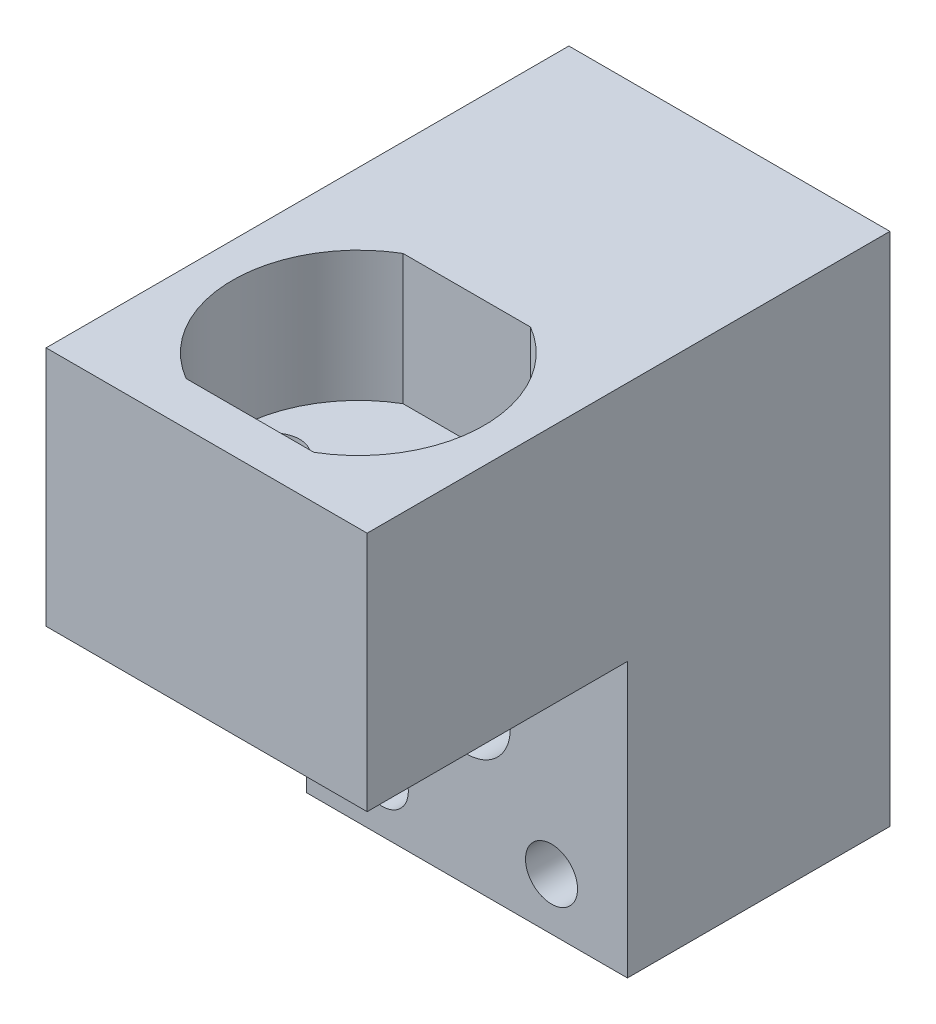
ISO-10303-21;
HEADER;
FILE_DESCRIPTION(('STEP AP214'),'2;1');
FILE_NAME('part.step','',(''),(''),'','','');
FILE_SCHEMA(('AUTOMOTIVE_DESIGN { 1 0 10303 214 1 1 1 1 }'));
ENDSEC;
DATA;
#1=APPLICATION_CONTEXT('core data for automotive mechanical design processes');
#2=APPLICATION_PROTOCOL_DEFINITION('international standard','automotive_design',2000,#1);
#3=PRODUCT_CONTEXT('',#1,'mechanical');
#4=PRODUCT('Part','Part','',(#3));
#5=PRODUCT_RELATED_PRODUCT_CATEGORY('part','',(#4));
#6=PRODUCT_DEFINITION_FORMATION('','',#4);
#7=PRODUCT_DEFINITION_CONTEXT('part definition',#1,'design');
#8=PRODUCT_DEFINITION('design','',#6,#7);
#9=PRODUCT_DEFINITION_SHAPE('','',#8);
#10=(LENGTH_UNIT() NAMED_UNIT(*) SI_UNIT(.MILLI.,.METRE.));
#11=(NAMED_UNIT(*) PLANE_ANGLE_UNIT() SI_UNIT($,.RADIAN.));
#12=(NAMED_UNIT(*) SI_UNIT($,.STERADIAN.) SOLID_ANGLE_UNIT());
#13=UNCERTAINTY_MEASURE_WITH_UNIT(LENGTH_MEASURE(1.E-05),#10,'distance_accuracy_value','');
#14=(GEOMETRIC_REPRESENTATION_CONTEXT(3) GLOBAL_UNCERTAINTY_ASSIGNED_CONTEXT((#13)) GLOBAL_UNIT_ASSIGNED_CONTEXT((#10,
#11,#12)) REPRESENTATION_CONTEXT('',''));
#15=CARTESIAN_POINT('',(0.,0.,0.));
#16=DIRECTION('',(0.,0.,1.));
#17=DIRECTION('',(1.,0.,0.));
#18=AXIS2_PLACEMENT_3D('',#15,#16,#17);
#19=CARTESIAN_POINT('',(-3.71715030208648,5.56,6.05));
#20=DIRECTION('',(0.,-1.,0.));
#21=DIRECTION('',(0.,0.,-1.));
#22=AXIS2_PLACEMENT_3D('',#19,#20,#21);
#23=PLANE('',#22);
#24=DIRECTION('',(0.,0.,-1.));
#25=VECTOR('',#24,1.);
#26=CARTESIAN_POINT('',(-3.71715030208648,5.56,6.05));
#27=LINE('',#26,#25);
#28=CARTESIAN_POINT('',(-3.71715030208648,5.56,12.05));
#29=VERTEX_POINT('',#28);
#30=CARTESIAN_POINT('',(-3.71715030208648,5.56,0.));
#31=VERTEX_POINT('',#30);
#32=EDGE_CURVE('E107',#29,#31,#27,.T.);
#33=ORIENTED_EDGE('',*,*,#32,.F.);
#34=DIRECTION('',(-1.,0.,0.));
#35=VECTOR('',#34,1.);
#36=CARTESIAN_POINT('',(-3.71715030208648,5.56,12.05));
#37=LINE('',#36,#35);
#38=CARTESIAN_POINT('',(3.68284982016476,5.56,12.05));
#39=VERTEX_POINT('',#38);
#40=EDGE_CURVE('E232',#39,#29,#37,.T.);
#41=ORIENTED_EDGE('',*,*,#40,.F.);
#42=DIRECTION('',(0.,0.,-1.));
#43=VECTOR('',#42,1.);
#44=CARTESIAN_POINT('',(3.68284982016476,5.56,6.05));
#45=LINE('',#44,#43);
#46=CARTESIAN_POINT('',(3.68284982016476,5.56,0.));
#47=VERTEX_POINT('',#46);
#48=EDGE_CURVE('E110',#39,#47,#45,.T.);
#49=ORIENTED_EDGE('',*,*,#48,.T.);
#50=DIRECTION('',(-1.,0.,0.));
#51=VECTOR('',#50,1.);
#52=CARTESIAN_POINT('',(-3.71715030208648,5.56,0.));
#53=LINE('',#52,#51);
#54=EDGE_CURVE('E102',#47,#31,#53,.T.);
#55=ORIENTED_EDGE('',*,*,#54,.T.);
#56=EDGE_LOOP('',(#33,#41,#49,#55));
#57=FACE_BOUND('',#56,.T.);
#58=CARTESIAN_POINT('',(-0.0184551588406046,5.56,8.55189772927024));
#59=DIRECTION('',(0.,1.,0.));
#60=DIRECTION('',(1.,0.,0.));
#61=AXIS2_PLACEMENT_3D('',#58,#59,#60);
#62=CIRCLE('',#61,2.9);
#63=CARTESIAN_POINT('',(-1.48814900451038,5.56,6.05189772927016));
#64=VERTEX_POINT('',#63);
#65=CARTESIAN_POINT('',(-1.49137234761084,5.56,11.05));
#66=VERTEX_POINT('',#65);
#67=EDGE_CURVE('E178',#64,#66,#62,.T.);
#68=ORIENTED_EDGE('',*,*,#67,.F.);
#69=DIRECTION('',(-1.,0.,0.));
#70=VECTOR('',#69,1.);
#71=CARTESIAN_POINT('',(1.33801083778449,5.56,6.05189772927015));
#72=LINE('',#71,#70);
#73=CARTESIAN_POINT('',(1.45123868682933,5.56,6.05189772927015));
#74=VERTEX_POINT('',#73);
#75=EDGE_CURVE('E177',#74,#64,#72,.T.);
#76=ORIENTED_EDGE('',*,*,#75,.F.);
#77=CARTESIAN_POINT('',(-0.0184551588404171,5.56,8.55189772927024));
#78=DIRECTION('',(0.,1.,0.));
#79=DIRECTION('',(1.,0.,0.));
#80=AXIS2_PLACEMENT_3D('',#77,#78,#79);
#81=CIRCLE('',#80,2.9);
#82=CARTESIAN_POINT('',(1.45446202992981,5.56,11.05));
#83=VERTEX_POINT('',#82);
#84=EDGE_CURVE('E168',#83,#74,#81,.T.);
#85=ORIENTED_EDGE('',*,*,#84,.F.);
#86=DIRECTION('',(-1.,0.,0.));
#87=VECTOR('',#86,1.);
#88=CARTESIAN_POINT('',(-3.71715030208648,5.56,11.05));
#89=LINE('',#88,#87);
#90=EDGE_CURVE('E158',#83,#66,#89,.T.);
#91=ORIENTED_EDGE('',*,*,#90,.T.);
#92=EDGE_LOOP('',(#68,#76,#85,#91));
#93=FACE_BOUND('',#92,.T.);
#94=ADVANCED_FACE('F61',(#57,#93),#23,.F.);
#95=CARTESIAN_POINT('',(0.,0.,6.05));
#96=DIRECTION('',(0.,0.,1.));
#97=DIRECTION('',(1.,0.,0.));
#98=AXIS2_PLACEMENT_3D('',#95,#96,#97);
#99=PLANE('',#98);
#100=CARTESIAN_POINT('',(-0.0171502409609882,-2.7,6.05));
#101=DIRECTION('',(0.,0.,1.));
#102=DIRECTION('',(1.,0.,0.));
#103=AXIS2_PLACEMENT_3D('',#100,#101,#102);
#104=CIRCLE('',#103,1.);
#105=CARTESIAN_POINT('',(0.982849759039012,-2.7,6.05));
#106=VERTEX_POINT('',#105);
#107=EDGE_CURVE('E243',#106,#106,#104,.T.);
#108=ORIENTED_EDGE('',*,*,#107,.F.);
#109=EDGE_LOOP('',(#108));
#110=FACE_BOUND('',#109,.T.);
#111=DIRECTION('',(1.,0.,0.));
#112=VECTOR('',#111,1.);
#113=CARTESIAN_POINT('',(-3.71715030208648,0.,6.05));
#114=LINE('',#113,#112);
#115=CARTESIAN_POINT('',(-3.71715030208648,0.,6.05));
#116=VERTEX_POINT('',#115);
#117=CARTESIAN_POINT('',(3.68284982016476,0.,6.05));
#118=VERTEX_POINT('',#117);
#119=EDGE_CURVE('E76',#116,#118,#114,.T.);
#120=ORIENTED_EDGE('',*,*,#119,.F.);
#121=DIRECTION('',(0.,-1.,0.));
#122=VECTOR('',#121,1.);
#123=CARTESIAN_POINT('',(-3.71715030208648,5.56,6.05));
#124=LINE('',#123,#122);
#125=CARTESIAN_POINT('',(-3.71715030208648,-6.32,6.05));
#126=VERTEX_POINT('',#125);
#127=EDGE_CURVE('E114',#116,#126,#124,.T.);
#128=ORIENTED_EDGE('',*,*,#127,.T.);
#129=DIRECTION('',(1.,0.,0.));
#130=VECTOR('',#129,1.);
#131=CARTESIAN_POINT('',(-3.71715030208648,-6.32,6.05));
#132=LINE('',#131,#130);
#133=CARTESIAN_POINT('',(3.68284982016476,-6.32,6.05));
#134=VERTEX_POINT('',#133);
#135=EDGE_CURVE('E82',#126,#134,#132,.T.);
#136=ORIENTED_EDGE('',*,*,#135,.T.);
#137=DIRECTION('',(0.,1.,0.));
#138=VECTOR('',#137,1.);
#139=CARTESIAN_POINT('',(3.68284982016476,5.56,6.05));
#140=LINE('',#139,#138);
#141=EDGE_CURVE('E125',#134,#118,#140,.T.);
#142=ORIENTED_EDGE('',*,*,#141,.T.);
#143=EDGE_LOOP('',(#120,#128,#136,#142));
#144=FACE_BOUND('',#143,.T.);
#145=CARTESIAN_POINT('',(-1.96715024096099,-5.12,6.05));
#146=DIRECTION('',(0.,0.,1.));
#147=DIRECTION('',(1.,0.,0.));
#148=AXIS2_PLACEMENT_3D('',#145,#146,#147);
#149=CIRCLE('',#148,0.6);
#150=CARTESIAN_POINT('',(-1.36715024096099,-5.12,6.05));
#151=VERTEX_POINT('',#150);
#152=EDGE_CURVE('E131',#151,#151,#149,.T.);
#153=ORIENTED_EDGE('',*,*,#152,.F.);
#154=EDGE_LOOP('',(#153));
#155=FACE_BOUND('',#154,.T.);
#156=CARTESIAN_POINT('',(1.93284975903901,-5.12,6.05));
#157=DIRECTION('',(0.,0.,1.));
#158=DIRECTION('',(1.,0.,0.));
#159=AXIS2_PLACEMENT_3D('',#156,#157,#158);
#160=CIRCLE('',#159,0.6);
#161=CARTESIAN_POINT('',(2.53284975903901,-5.12,6.05));
#162=VERTEX_POINT('',#161);
#163=EDGE_CURVE('E207',#162,#162,#160,.T.);
#164=ORIENTED_EDGE('',*,*,#163,.F.);
#165=EDGE_LOOP('',(#164));
#166=FACE_BOUND('',#165,.T.);
#167=ADVANCED_FACE('F215',(#110,#144,#155,#166),#99,.T.);
#168=CARTESIAN_POINT('',(0.,0.,0.));
#169=DIRECTION('',(0.,0.,1.));
#170=DIRECTION('',(1.,0.,0.));
#171=AXIS2_PLACEMENT_3D('',#168,#169,#170);
#172=PLANE('',#171);
#173=CARTESIAN_POINT('',(-0.0171502409609882,-2.7,0.));
#174=DIRECTION('',(0.,0.,-1.));
#175=DIRECTION('',(-1.,0.,0.));
#176=AXIS2_PLACEMENT_3D('',#173,#174,#175);
#177=CIRCLE('',#176,1.);
#178=CARTESIAN_POINT('',(-1.01715024096099,-2.7,0.));
#179=VERTEX_POINT('',#178);
#180=EDGE_CURVE('E235',#179,#179,#177,.T.);
#181=ORIENTED_EDGE('',*,*,#180,.F.);
#182=EDGE_LOOP('',(#181));
#183=FACE_BOUND('',#182,.T.);
#184=DIRECTION('',(0.,-1.,0.));
#185=VECTOR('',#184,1.);
#186=CARTESIAN_POINT('',(-3.71715030208648,5.56,0.));
#187=LINE('',#186,#185);
#188=CARTESIAN_POINT('',(-3.71715030208648,-6.32,0.));
#189=VERTEX_POINT('',#188);
#190=EDGE_CURVE('E121',#31,#189,#187,.T.);
#191=ORIENTED_EDGE('',*,*,#190,.F.);
#192=ORIENTED_EDGE('',*,*,#54,.F.);
#193=DIRECTION('',(0.,1.,0.));
#194=VECTOR('',#193,1.);
#195=CARTESIAN_POINT('',(3.68284982016476,5.56,0.));
#196=LINE('',#195,#194);
#197=CARTESIAN_POINT('',(3.68284982016476,-6.32,0.));
#198=VERTEX_POINT('',#197);
#199=EDGE_CURVE('E115',#198,#47,#196,.T.);
#200=ORIENTED_EDGE('',*,*,#199,.F.);
#201=DIRECTION('',(1.,0.,0.));
#202=VECTOR('',#201,1.);
#203=CARTESIAN_POINT('',(-3.71715030208648,-6.32,0.));
#204=LINE('',#203,#202);
#205=EDGE_CURVE('E129',#189,#198,#204,.T.);
#206=ORIENTED_EDGE('',*,*,#205,.F.);
#207=EDGE_LOOP('',(#191,#192,#200,#206));
#208=FACE_BOUND('',#207,.T.);
#209=CARTESIAN_POINT('',(-1.96715024096099,-5.12,0.));
#210=DIRECTION('',(0.,0.,1.));
#211=DIRECTION('',(1.,0.,0.));
#212=AXIS2_PLACEMENT_3D('',#209,#210,#211);
#213=CIRCLE('',#212,0.6);
#214=CARTESIAN_POINT('',(-1.36715024096099,-5.12,0.));
#215=VERTEX_POINT('',#214);
#216=EDGE_CURVE('E135',#215,#215,#213,.T.);
#217=ORIENTED_EDGE('',*,*,#216,.T.);
#218=EDGE_LOOP('',(#217));
#219=FACE_BOUND('',#218,.T.);
#220=CARTESIAN_POINT('',(1.93284975903901,-5.12,0.));
#221=DIRECTION('',(0.,0.,1.));
#222=DIRECTION('',(1.,0.,0.));
#223=AXIS2_PLACEMENT_3D('',#220,#221,#222);
#224=CIRCLE('',#223,0.6);
#225=CARTESIAN_POINT('',(2.53284975903901,-5.12,0.));
#226=VERTEX_POINT('',#225);
#227=EDGE_CURVE('E206',#226,#226,#224,.T.);
#228=ORIENTED_EDGE('',*,*,#227,.T.);
#229=EDGE_LOOP('',(#228));
#230=FACE_BOUND('',#229,.T.);
#231=ADVANCED_FACE('F127',(#183,#208,#219,#230),#172,.F.);
#232=CARTESIAN_POINT('',(-3.71715030208648,5.56,6.05));
#233=DIRECTION('',(1.,0.,0.));
#234=DIRECTION('',(0.,1.,0.));
#235=AXIS2_PLACEMENT_3D('',#232,#233,#234);
#236=PLANE('',#235);
#237=ORIENTED_EDGE('',*,*,#190,.T.);
#238=DIRECTION('',(0.,0.,-1.));
#239=VECTOR('',#238,1.);
#240=CARTESIAN_POINT('',(-3.71715030208648,-6.32,6.05));
#241=LINE('',#240,#239);
#242=EDGE_CURVE('E145',#126,#189,#241,.T.);
#243=ORIENTED_EDGE('',*,*,#242,.F.);
#244=ORIENTED_EDGE('',*,*,#127,.F.);
#245=DIRECTION('',(0.,0.,-1.));
#246=VECTOR('',#245,1.);
#247=CARTESIAN_POINT('',(-3.71715030208648,0.,11.05));
#248=LINE('',#247,#246);
#249=CARTESIAN_POINT('',(-3.71715030208648,0.,12.05));
#250=VERTEX_POINT('',#249);
#251=EDGE_CURVE('E203',#250,#116,#248,.T.);
#252=ORIENTED_EDGE('',*,*,#251,.F.);
#253=DIRECTION('',(0.,-1.,0.));
#254=VECTOR('',#253,1.);
#255=CARTESIAN_POINT('',(-3.71715030208648,5.56,12.05));
#256=LINE('',#255,#254);
#257=EDGE_CURVE('E124',#29,#250,#256,.T.);
#258=ORIENTED_EDGE('',*,*,#257,.F.);
#259=ORIENTED_EDGE('',*,*,#32,.T.);
#260=EDGE_LOOP('',(#237,#243,#244,#252,#258,#259));
#261=FACE_BOUND('',#260,.T.);
#262=ADVANCED_FACE('F63',(#261),#236,.F.);
#263=CARTESIAN_POINT('',(-3.71715030208648,-6.32,6.05));
#264=DIRECTION('',(0.,1.,0.));
#265=DIRECTION('',(0.,0.,1.));
#266=AXIS2_PLACEMENT_3D('',#263,#264,#265);
#267=PLANE('',#266);
#268=ORIENTED_EDGE('',*,*,#205,.T.);
#269=DIRECTION('',(0.,0.,-1.));
#270=VECTOR('',#269,1.);
#271=CARTESIAN_POINT('',(3.68284982016476,-6.32,6.05));
#272=LINE('',#271,#270);
#273=EDGE_CURVE('E142',#134,#198,#272,.T.);
#274=ORIENTED_EDGE('',*,*,#273,.F.);
#275=ORIENTED_EDGE('',*,*,#135,.F.);
#276=ORIENTED_EDGE('',*,*,#242,.T.);
#277=EDGE_LOOP('',(#268,#274,#275,#276));
#278=FACE_BOUND('',#277,.T.);
#279=ADVANCED_FACE('F285',(#278),#267,.F.);
#280=CARTESIAN_POINT('',(3.68284982016476,5.56,6.05));
#281=DIRECTION('',(-1.,0.,0.));
#282=DIRECTION('',(0.,-1.,0.));
#283=AXIS2_PLACEMENT_3D('',#280,#281,#282);
#284=PLANE('',#283);
#285=ORIENTED_EDGE('',*,*,#199,.T.);
#286=ORIENTED_EDGE('',*,*,#48,.F.);
#287=DIRECTION('',(0.,1.,0.));
#288=VECTOR('',#287,1.);
#289=CARTESIAN_POINT('',(3.68284982016476,5.56,12.05));
#290=LINE('',#289,#288);
#291=CARTESIAN_POINT('',(3.68284982016476,0.,12.05));
#292=VERTEX_POINT('',#291);
#293=EDGE_CURVE('E227',#292,#39,#290,.T.);
#294=ORIENTED_EDGE('',*,*,#293,.F.);
#295=DIRECTION('',(0.,0.,-1.));
#296=VECTOR('',#295,1.);
#297=CARTESIAN_POINT('',(3.68284982016476,0.,11.05));
#298=LINE('',#297,#296);
#299=EDGE_CURVE('E200',#292,#118,#298,.T.);
#300=ORIENTED_EDGE('',*,*,#299,.T.);
#301=ORIENTED_EDGE('',*,*,#141,.F.);
#302=ORIENTED_EDGE('',*,*,#273,.T.);
#303=EDGE_LOOP('',(#285,#286,#294,#300,#301,#302));
#304=FACE_BOUND('',#303,.T.);
#305=ADVANCED_FACE('F225',(#304),#284,.F.);
#306=CARTESIAN_POINT('',(-1.96715024096099,-5.12,6.05));
#307=DIRECTION('',(0.,0.,-1.));
#308=DIRECTION('',(-1.,0.,0.));
#309=AXIS2_PLACEMENT_3D('',#306,#307,#308);
#310=CYLINDRICAL_SURFACE('',#309,0.6);
#311=ORIENTED_EDGE('',*,*,#152,.T.);
#312=EDGE_LOOP('',(#311));
#313=FACE_BOUND('',#312,.T.);
#314=ORIENTED_EDGE('',*,*,#216,.F.);
#315=EDGE_LOOP('',(#314));
#316=FACE_BOUND('',#315,.T.);
#317=ADVANCED_FACE('F284',(#313,#316),#310,.F.);
#318=CARTESIAN_POINT('',(1.93284975903901,-5.12,6.05));
#319=DIRECTION('',(0.,0.,-1.));
#320=DIRECTION('',(-1.,0.,0.));
#321=AXIS2_PLACEMENT_3D('',#318,#319,#320);
#322=CYLINDRICAL_SURFACE('',#321,0.6);
#323=ORIENTED_EDGE('',*,*,#163,.T.);
#324=EDGE_LOOP('',(#323));
#325=FACE_BOUND('',#324,.T.);
#326=ORIENTED_EDGE('',*,*,#227,.F.);
#327=EDGE_LOOP('',(#326));
#328=FACE_BOUND('',#327,.T.);
#329=ADVANCED_FACE('F326',(#325,#328),#322,.F.);
#330=CARTESIAN_POINT('',(-3.71715030208648,0.,11.05));
#331=DIRECTION('',(0.,1.,0.));
#332=DIRECTION('',(0.,0.,1.));
#333=AXIS2_PLACEMENT_3D('',#330,#331,#332);
#334=PLANE('',#333);
#335=CARTESIAN_POINT('',(-1.96845515884054,0.,8.55189772927025));
#336=DIRECTION('',(0.,1.,0.));
#337=DIRECTION('',(0.,0.,1.));
#338=AXIS2_PLACEMENT_3D('',#335,#336,#337);
#339=CIRCLE('',#338,0.6);
#340=CARTESIAN_POINT('',(-1.96845515884054,0.,9.15189772927025));
#341=VERTEX_POINT('',#340);
#342=EDGE_CURVE('E190',#341,#341,#339,.T.);
#343=ORIENTED_EDGE('',*,*,#342,.T.);
#344=EDGE_LOOP('',(#343));
#345=FACE_BOUND('',#344,.T.);
#346=CARTESIAN_POINT('',(1.93154484115946,0.,8.55189772927022));
#347=DIRECTION('',(0.,1.,0.));
#348=DIRECTION('',(0.,0.,1.));
#349=AXIS2_PLACEMENT_3D('',#346,#347,#348);
#350=CIRCLE('',#349,0.6);
#351=CARTESIAN_POINT('',(1.93154484115946,0.,9.15189772927022));
#352=VERTEX_POINT('',#351);
#353=EDGE_CURVE('E250',#352,#352,#350,.T.);
#354=ORIENTED_EDGE('',*,*,#353,.T.);
#355=EDGE_LOOP('',(#354));
#356=FACE_BOUND('',#355,.T.);
#357=ORIENTED_EDGE('',*,*,#119,.T.);
#358=ORIENTED_EDGE('',*,*,#299,.F.);
#359=DIRECTION('',(1.,0.,0.));
#360=VECTOR('',#359,1.);
#361=CARTESIAN_POINT('',(-3.71715030208648,0.,12.05));
#362=LINE('',#361,#360);
#363=EDGE_CURVE('E233',#250,#292,#362,.T.);
#364=ORIENTED_EDGE('',*,*,#363,.F.);
#365=ORIENTED_EDGE('',*,*,#251,.T.);
#366=EDGE_LOOP('',(#357,#358,#364,#365));
#367=FACE_BOUND('',#366,.T.);
#368=ADVANCED_FACE('F220',(#345,#356,#367),#334,.F.);
#369=CARTESIAN_POINT('',(-0.0184551588406046,5.56,8.55189772927024));
#370=DIRECTION('',(0.,-1.,0.));
#371=DIRECTION('',(0.,0.,-1.));
#372=AXIS2_PLACEMENT_3D('',#369,#370,#371);
#373=CYLINDRICAL_SURFACE('',#372,2.9);
#374=CARTESIAN_POINT('',(-0.0184551588406046,2.56,8.55189772927024));
#375=DIRECTION('',(0.,1.,0.));
#376=DIRECTION('',(1.,0.,0.));
#377=AXIS2_PLACEMENT_3D('',#374,#375,#376);
#378=CIRCLE('',#377,2.9);
#379=CARTESIAN_POINT('',(-1.48814900451038,2.56,6.05189772927016));
#380=VERTEX_POINT('',#379);
#381=CARTESIAN_POINT('',(-1.49137234761084,2.56,11.05));
#382=VERTEX_POINT('',#381);
#383=EDGE_CURVE('E187',#380,#382,#378,.T.);
#384=ORIENTED_EDGE('',*,*,#383,.F.);
#385=DIRECTION('',(0.,-1.,0.));
#386=VECTOR('',#385,1.);
#387=CARTESIAN_POINT('',(-1.48814900451038,5.56,6.05189772927016));
#388=LINE('',#387,#386);
#389=EDGE_CURVE('E180',#64,#380,#388,.T.);
#390=ORIENTED_EDGE('',*,*,#389,.F.);
#391=ORIENTED_EDGE('',*,*,#67,.T.);
#392=DIRECTION('',(0.,-1.,0.));
#393=VECTOR('',#392,1.);
#394=CARTESIAN_POINT('',(-1.49137234761084,5.56,11.05));
#395=LINE('',#394,#393);
#396=EDGE_CURVE('E12',#382,#66,#395,.F.);
#397=ORIENTED_EDGE('',*,*,#396,.F.);
#398=EDGE_LOOP('',(#384,#390,#391,#397));
#399=FACE_BOUND('',#398,.T.);
#400=ADVANCED_FACE('F307',(#399),#373,.F.);
#401=CARTESIAN_POINT('',(-0.0184551588404171,5.56,8.55189772927024));
#402=DIRECTION('',(0.,-1.,0.));
#403=DIRECTION('',(0.,0.,-1.));
#404=AXIS2_PLACEMENT_3D('',#401,#402,#403);
#405=CYLINDRICAL_SURFACE('',#404,2.9);
#406=ORIENTED_EDGE('',*,*,#84,.T.);
#407=DIRECTION('',(0.,-1.,0.));
#408=VECTOR('',#407,1.);
#409=CARTESIAN_POINT('',(1.45123868682933,5.56,6.05189772927015));
#410=LINE('',#409,#408);
#411=CARTESIAN_POINT('',(1.45123868682933,2.56,6.05189772927015));
#412=VERTEX_POINT('',#411);
#413=EDGE_CURVE('E196',#74,#412,#410,.T.);
#414=ORIENTED_EDGE('',*,*,#413,.T.);
#415=CARTESIAN_POINT('',(-0.0184551588404171,2.56,8.55189772927024));
#416=DIRECTION('',(0.,1.,0.));
#417=DIRECTION('',(1.,0.,0.));
#418=AXIS2_PLACEMENT_3D('',#415,#416,#417);
#419=CIRCLE('',#418,2.9);
#420=CARTESIAN_POINT('',(1.45446202992981,2.56,11.05));
#421=VERTEX_POINT('',#420);
#422=EDGE_CURVE('E171',#421,#412,#419,.T.);
#423=ORIENTED_EDGE('',*,*,#422,.F.);
#424=DIRECTION('',(0.,-1.,0.));
#425=VECTOR('',#424,1.);
#426=CARTESIAN_POINT('',(1.45446202992981,5.56,11.05));
#427=LINE('',#426,#425);
#428=EDGE_CURVE('E69',#83,#421,#427,.T.);
#429=ORIENTED_EDGE('',*,*,#428,.F.);
#430=EDGE_LOOP('',(#406,#414,#423,#429));
#431=FACE_BOUND('',#430,.T.);
#432=ADVANCED_FACE('F165',(#431),#405,.F.);
#433=CARTESIAN_POINT('',(1.33801083778449,5.56,6.05189772927015));
#434=DIRECTION('',(0.,0.,1.));
#435=DIRECTION('',(1.,0.,0.));
#436=AXIS2_PLACEMENT_3D('',#433,#434,#435);
#437=PLANE('',#436);
#438=DIRECTION('',(-1.,0.,0.));
#439=VECTOR('',#438,1.);
#440=CARTESIAN_POINT('',(1.33801083778449,2.56,6.05189772927015));
#441=LINE('',#440,#439);
#442=EDGE_CURVE('E183',#412,#380,#441,.T.);
#443=ORIENTED_EDGE('',*,*,#442,.F.);
#444=ORIENTED_EDGE('',*,*,#413,.F.);
#445=ORIENTED_EDGE('',*,*,#75,.T.);
#446=ORIENTED_EDGE('',*,*,#389,.T.);
#447=EDGE_LOOP('',(#443,#444,#445,#446));
#448=FACE_BOUND('',#447,.T.);
#449=ADVANCED_FACE('F310',(#448),#437,.T.);
#450=CARTESIAN_POINT('',(-0.0184551588406046,2.56,8.55189772927024));
#451=DIRECTION('',(0.,1.,0.));
#452=DIRECTION('',(0.,0.,1.));
#453=AXIS2_PLACEMENT_3D('',#450,#451,#452);
#454=PLANE('',#453);
#455=CARTESIAN_POINT('',(-1.96845515884054,2.56,8.55189772927025));
#456=DIRECTION('',(0.,1.,0.));
#457=DIRECTION('',(0.,0.,1.));
#458=AXIS2_PLACEMENT_3D('',#455,#456,#457);
#459=CIRCLE('',#458,0.6);
#460=CARTESIAN_POINT('',(-1.96845515884054,2.56,9.15189772927025));
#461=VERTEX_POINT('',#460);
#462=EDGE_CURVE('E247',#461,#461,#459,.T.);
#463=ORIENTED_EDGE('',*,*,#462,.F.);
#464=EDGE_LOOP('',(#463));
#465=FACE_BOUND('',#464,.T.);
#466=CARTESIAN_POINT('',(1.93154484115946,2.56,8.55189772927022));
#467=DIRECTION('',(0.,1.,0.));
#468=DIRECTION('',(0.,0.,1.));
#469=AXIS2_PLACEMENT_3D('',#466,#467,#468);
#470=CIRCLE('',#469,0.6);
#471=CARTESIAN_POINT('',(1.93154484115946,2.56,9.15189772927022));
#472=VERTEX_POINT('',#471);
#473=EDGE_CURVE('E246',#472,#472,#470,.T.);
#474=ORIENTED_EDGE('',*,*,#473,.F.);
#475=EDGE_LOOP('',(#474));
#476=FACE_BOUND('',#475,.T.);
#477=ORIENTED_EDGE('',*,*,#422,.T.);
#478=ORIENTED_EDGE('',*,*,#442,.T.);
#479=ORIENTED_EDGE('',*,*,#383,.T.);
#480=DIRECTION('',(-1.,0.,0.));
#481=VECTOR('',#480,1.);
#482=CARTESIAN_POINT('',(0.,2.56,11.05));
#483=LINE('',#482,#481);
#484=EDGE_CURVE('E155',#421,#382,#483,.T.);
#485=ORIENTED_EDGE('',*,*,#484,.F.);
#486=EDGE_LOOP('',(#477,#478,#479,#485));
#487=FACE_BOUND('',#486,.T.);
#488=ADVANCED_FACE('F271',(#465,#476,#487),#454,.T.);
#489=CARTESIAN_POINT('',(1.93154484115946,-6.32,8.55189772927022));
#490=DIRECTION('',(0.,1.,0.));
#491=DIRECTION('',(0.,0.,1.));
#492=AXIS2_PLACEMENT_3D('',#489,#490,#491);
#493=CYLINDRICAL_SURFACE('',#492,0.6);
#494=ORIENTED_EDGE('',*,*,#473,.T.);
#495=EDGE_LOOP('',(#494));
#496=FACE_BOUND('',#495,.T.);
#497=ORIENTED_EDGE('',*,*,#353,.F.);
#498=EDGE_LOOP('',(#497));
#499=FACE_BOUND('',#498,.T.);
#500=ADVANCED_FACE('F262',(#496,#499),#493,.F.);
#501=CARTESIAN_POINT('',(-1.96845515884054,-6.32,8.55189772927025));
#502=DIRECTION('',(0.,1.,0.));
#503=DIRECTION('',(0.,0.,1.));
#504=AXIS2_PLACEMENT_3D('',#501,#502,#503);
#505=CYLINDRICAL_SURFACE('',#504,0.6);
#506=ORIENTED_EDGE('',*,*,#462,.T.);
#507=EDGE_LOOP('',(#506));
#508=FACE_BOUND('',#507,.T.);
#509=ORIENTED_EDGE('',*,*,#342,.F.);
#510=EDGE_LOOP('',(#509));
#511=FACE_BOUND('',#510,.T.);
#512=ADVANCED_FACE('F259',(#508,#511),#505,.F.);
#513=CARTESIAN_POINT('',(-0.0171502409609882,-2.7,11.05));
#514=DIRECTION('',(0.,0.,-1.));
#515=DIRECTION('',(-1.,0.,0.));
#516=AXIS2_PLACEMENT_3D('',#513,#514,#515);
#517=CYLINDRICAL_SURFACE('',#516,1.);
#518=ORIENTED_EDGE('',*,*,#107,.T.);
#519=EDGE_LOOP('',(#518));
#520=FACE_BOUND('',#519,.T.);
#521=ORIENTED_EDGE('',*,*,#180,.T.);
#522=EDGE_LOOP('',(#521));
#523=FACE_BOUND('',#522,.T.);
#524=ADVANCED_FACE('F261',(#520,#523),#517,.F.);
#525=CARTESIAN_POINT('',(0.,0.,11.05));
#526=DIRECTION('',(0.,0.,1.));
#527=DIRECTION('',(1.,0.,0.));
#528=AXIS2_PLACEMENT_3D('',#525,#526,#527);
#529=PLANE('',#528);
#530=ORIENTED_EDGE('',*,*,#484,.T.);
#531=ORIENTED_EDGE('',*,*,#396,.T.);
#532=ORIENTED_EDGE('',*,*,#90,.F.);
#533=ORIENTED_EDGE('',*,*,#428,.T.);
#534=EDGE_LOOP('',(#530,#531,#532,#533));
#535=FACE_BOUND('',#534,.T.);
#536=ADVANCED_FACE('F152',(#535),#529,.F.);
#537=CARTESIAN_POINT('',(0.,0.,12.05));
#538=DIRECTION('',(0.,0.,1.));
#539=DIRECTION('',(1.,0.,0.));
#540=AXIS2_PLACEMENT_3D('',#537,#538,#539);
#541=PLANE('',#540);
#542=ORIENTED_EDGE('',*,*,#257,.T.);
#543=ORIENTED_EDGE('',*,*,#363,.T.);
#544=ORIENTED_EDGE('',*,*,#293,.T.);
#545=ORIENTED_EDGE('',*,*,#40,.T.);
#546=EDGE_LOOP('',(#542,#543,#544,#545));
#547=FACE_BOUND('',#546,.T.);
#548=ADVANCED_FACE('F292',(#547),#541,.T.);
#549=CLOSED_SHELL('',(#94,#167,#231,#262,#279,#305,#317,#329,#368,#400,#432,#449,#488,#500,#512,
#524,#536,#548));
#550=MANIFOLD_SOLID_BREP('B2',#549);
#551=ADVANCED_BREP_SHAPE_REPRESENTATION('',(#18,#550),#14);
#552=SHAPE_DEFINITION_REPRESENTATION(#9,#551);
ENDSEC;
END-ISO-10303-21;
